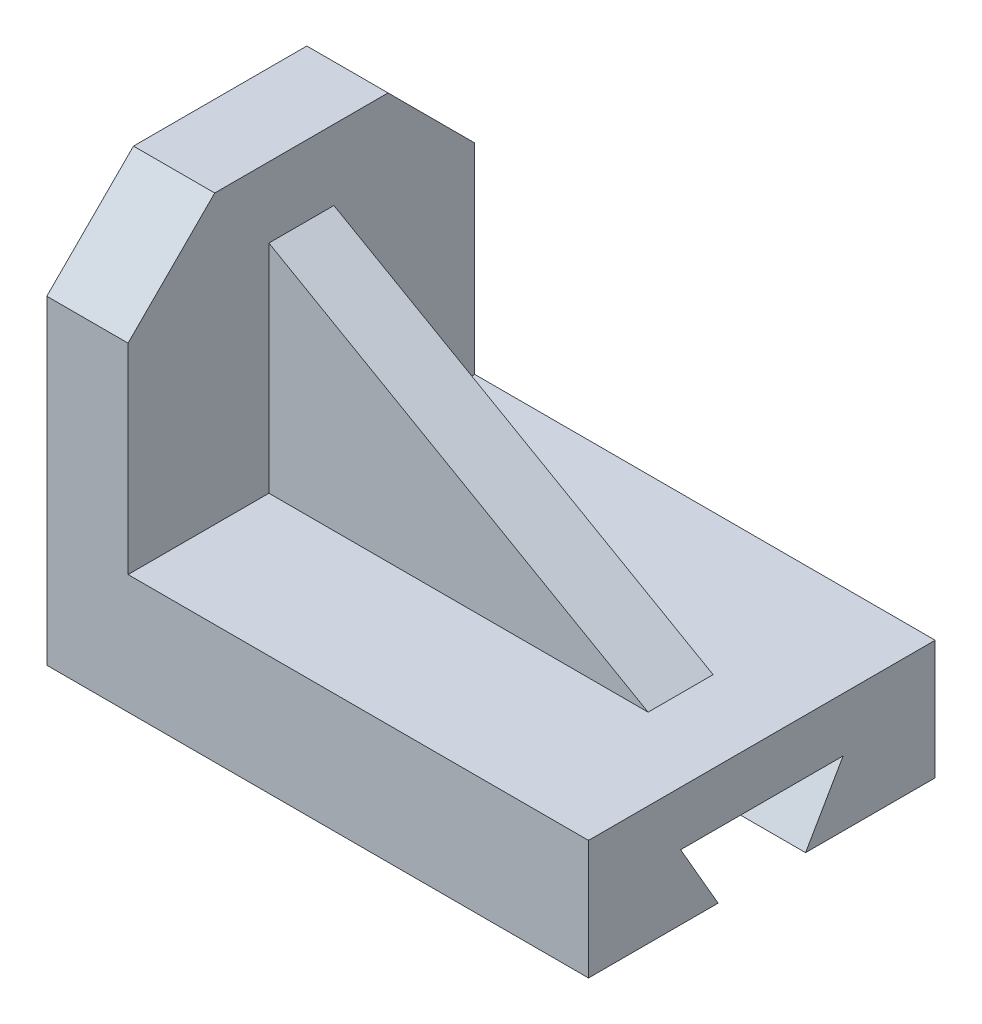
ISO-10303-21;
HEADER;
FILE_DESCRIPTION(('STEP AP214'),'2;1');
FILE_NAME('part.step','',(''),(''),'','','');
FILE_SCHEMA(('AUTOMOTIVE_DESIGN { 1 0 10303 214 1 1 1 1 }'));
ENDSEC;
DATA;
#1=APPLICATION_CONTEXT('core data for automotive mechanical design processes');
#2=APPLICATION_PROTOCOL_DEFINITION('international standard','automotive_design',2000,#1);
#3=PRODUCT_CONTEXT('',#1,'mechanical');
#4=PRODUCT('Part','Part','',(#3));
#5=PRODUCT_RELATED_PRODUCT_CATEGORY('part','',(#4));
#6=PRODUCT_DEFINITION_FORMATION('','',#4);
#7=PRODUCT_DEFINITION_CONTEXT('part definition',#1,'design');
#8=PRODUCT_DEFINITION('design','',#6,#7);
#9=PRODUCT_DEFINITION_SHAPE('','',#8);
#10=(LENGTH_UNIT() NAMED_UNIT(*) SI_UNIT(.MILLI.,.METRE.));
#11=(NAMED_UNIT(*) PLANE_ANGLE_UNIT() SI_UNIT($,.RADIAN.));
#12=(NAMED_UNIT(*) SI_UNIT($,.STERADIAN.) SOLID_ANGLE_UNIT());
#13=UNCERTAINTY_MEASURE_WITH_UNIT(LENGTH_MEASURE(1.E-05),#10,'distance_accuracy_value','');
#14=(GEOMETRIC_REPRESENTATION_CONTEXT(3) GLOBAL_UNCERTAINTY_ASSIGNED_CONTEXT((#13)) GLOBAL_UNIT_ASSIGNED_CONTEXT((#10,
#11,#12)) REPRESENTATION_CONTEXT('',''));
#15=CARTESIAN_POINT('',(0.,0.,0.));
#16=DIRECTION('',(0.,0.,1.));
#17=DIRECTION('',(1.,0.,0.));
#18=AXIS2_PLACEMENT_3D('',#15,#16,#17);
#19=CARTESIAN_POINT('',(0.,0.,0.));
#20=DIRECTION('',(0.,1.,0.));
#21=DIRECTION('',(0.,0.,1.));
#22=AXIS2_PLACEMENT_3D('',#19,#20,#21);
#23=PLANE('',#22);
#24=DIRECTION('',(0.,0.,1.));
#25=VECTOR('',#24,1.);
#26=CARTESIAN_POINT('',(-50.,0.,-32.));
#27=LINE('',#26,#25);
#28=CARTESIAN_POINT('',(-50.,0.,8.07179676972441));
#29=VERTEX_POINT('',#28);
#30=CARTESIAN_POINT('',(-50.,0.,32.));
#31=VERTEX_POINT('',#30);
#32=EDGE_CURVE('E242',#29,#31,#27,.T.);
#33=ORIENTED_EDGE('',*,*,#32,.F.);
#34=DIRECTION('',(1.,0.,0.));
#35=VECTOR('',#34,1.);
#36=CARTESIAN_POINT('',(-50.,0.,8.07179676972441));
#37=LINE('',#36,#35);
#38=CARTESIAN_POINT('',(50.,0.,8.07179676972441));
#39=VERTEX_POINT('',#38);
#40=EDGE_CURVE('E185',#29,#39,#37,.T.);
#41=ORIENTED_EDGE('',*,*,#40,.T.);
#42=DIRECTION('',(0.,0.,-1.));
#43=VECTOR('',#42,1.);
#44=CARTESIAN_POINT('',(50.,0.,32.));
#45=LINE('',#44,#43);
#46=CARTESIAN_POINT('',(50.,0.,32.));
#47=VERTEX_POINT('',#46);
#48=EDGE_CURVE('E235',#47,#39,#45,.T.);
#49=ORIENTED_EDGE('',*,*,#48,.F.);
#50=DIRECTION('',(1.,0.,0.));
#51=VECTOR('',#50,1.);
#52=CARTESIAN_POINT('',(-50.,0.,32.));
#53=LINE('',#52,#51);
#54=EDGE_CURVE('E246',#31,#47,#53,.T.);
#55=ORIENTED_EDGE('',*,*,#54,.F.);
#56=EDGE_LOOP('',(#33,#41,#49,#55));
#57=FACE_BOUND('',#56,.T.);
#58=ADVANCED_FACE('F37',(#57),#23,.F.);
#59=CARTESIAN_POINT('',(0.,22.,0.));
#60=DIRECTION('',(0.,1.,0.));
#61=DIRECTION('',(0.,0.,1.));
#62=AXIS2_PLACEMENT_3D('',#59,#60,#61);
#63=PLANE('',#62);
#64=DIRECTION('',(1.,0.,0.));
#65=VECTOR('',#64,1.);
#66=CARTESIAN_POINT('',(0.,22.,6.));
#67=LINE('',#66,#65);
#68=CARTESIAN_POINT('',(-35.,22.,6.));
#69=VERTEX_POINT('',#68);
#70=CARTESIAN_POINT('',(35.,22.,6.));
#71=VERTEX_POINT('',#70);
#72=EDGE_CURVE('E165',#69,#71,#67,.T.);
#73=ORIENTED_EDGE('',*,*,#72,.F.);
#74=DIRECTION('',(0.,0.,1.));
#75=VECTOR('',#74,1.);
#76=CARTESIAN_POINT('',(-35.,22.,32.));
#77=LINE('',#76,#75);
#78=CARTESIAN_POINT('',(-35.,22.,32.));
#79=VERTEX_POINT('',#78);
#80=EDGE_CURVE('E162',#69,#79,#77,.T.);
#81=ORIENTED_EDGE('',*,*,#80,.T.);
#82=DIRECTION('',(1.,0.,0.));
#83=VECTOR('',#82,1.);
#84=CARTESIAN_POINT('',(-50.,22.,32.));
#85=LINE('',#84,#83);
#86=CARTESIAN_POINT('',(50.,22.,32.));
#87=VERTEX_POINT('',#86);
#88=EDGE_CURVE('E234',#79,#87,#85,.T.);
#89=ORIENTED_EDGE('',*,*,#88,.T.);
#90=DIRECTION('',(0.,0.,-1.));
#91=VECTOR('',#90,1.);
#92=CARTESIAN_POINT('',(50.,22.,32.));
#93=LINE('',#92,#91);
#94=CARTESIAN_POINT('',(50.,22.,-32.));
#95=VERTEX_POINT('',#94);
#96=EDGE_CURVE('E237',#87,#95,#93,.T.);
#97=ORIENTED_EDGE('',*,*,#96,.T.);
#98=DIRECTION('',(-1.,0.,0.));
#99=VECTOR('',#98,1.);
#100=CARTESIAN_POINT('',(50.,22.,-32.));
#101=LINE('',#100,#99);
#102=CARTESIAN_POINT('',(-35.,22.,-32.));
#103=VERTEX_POINT('',#102);
#104=EDGE_CURVE('E231',#95,#103,#101,.T.);
#105=ORIENTED_EDGE('',*,*,#104,.T.);
#106=CARTESIAN_POINT('',(-35.,22.,-6.));
#107=VERTEX_POINT('',#106);
#108=EDGE_CURVE('E195',#103,#107,#77,.T.);
#109=ORIENTED_EDGE('',*,*,#108,.T.);
#110=DIRECTION('',(1.,0.,0.));
#111=VECTOR('',#110,1.);
#112=CARTESIAN_POINT('',(0.,22.,-6.));
#113=LINE('',#112,#111);
#114=CARTESIAN_POINT('',(35.,22.,-6.));
#115=VERTEX_POINT('',#114);
#116=EDGE_CURVE('E52',#107,#115,#113,.T.);
#117=ORIENTED_EDGE('',*,*,#116,.T.);
#118=DIRECTION('',(0.,0.,1.));
#119=VECTOR('',#118,1.);
#120=CARTESIAN_POINT('',(35.,22.,0.));
#121=LINE('',#120,#119);
#122=EDGE_CURVE('E155',#71,#115,#121,.F.);
#123=ORIENTED_EDGE('',*,*,#122,.F.);
#124=EDGE_LOOP('',(#73,#81,#89,#97,#105,#109,#117,#123));
#125=FACE_BOUND('',#124,.T.);
#126=ADVANCED_FACE('F292',(#125),#63,.T.);
#127=CARTESIAN_POINT('',(50.,22.,-32.));
#128=DIRECTION('',(0.,0.,1.));
#129=DIRECTION('',(1.,0.,0.));
#130=AXIS2_PLACEMENT_3D('',#127,#128,#129);
#131=PLANE('',#130);
#132=DIRECTION('',(-1.,0.,0.));
#133=VECTOR('',#132,1.);
#134=CARTESIAN_POINT('',(50.,0.,-32.));
#135=LINE('',#134,#133);
#136=CARTESIAN_POINT('',(50.,0.,-32.));
#137=VERTEX_POINT('',#136);
#138=CARTESIAN_POINT('',(-50.,0.,-32.));
#139=VERTEX_POINT('',#138);
#140=EDGE_CURVE('E224',#137,#139,#135,.T.);
#141=ORIENTED_EDGE('',*,*,#140,.T.);
#142=DIRECTION('',(0.,-1.,0.));
#143=VECTOR('',#142,1.);
#144=CARTESIAN_POINT('',(-50.,22.,-32.));
#145=LINE('',#144,#143);
#146=CARTESIAN_POINT('',(-50.,59.,-32.));
#147=VERTEX_POINT('',#146);
#148=EDGE_CURVE('E45',#147,#139,#145,.T.);
#149=ORIENTED_EDGE('',*,*,#148,.F.);
#150=DIRECTION('',(-1.,0.,0.));
#151=VECTOR('',#150,1.);
#152=CARTESIAN_POINT('',(-35.,59.,-32.));
#153=LINE('',#152,#151);
#154=CARTESIAN_POINT('',(-35.,59.,-32.));
#155=VERTEX_POINT('',#154);
#156=EDGE_CURVE('E221',#155,#147,#153,.T.);
#157=ORIENTED_EDGE('',*,*,#156,.F.);
#158=DIRECTION('',(0.,-1.,0.));
#159=VECTOR('',#158,1.);
#160=CARTESIAN_POINT('',(-35.,22.,-32.));
#161=LINE('',#160,#159);
#162=EDGE_CURVE('E209',#155,#103,#161,.T.);
#163=ORIENTED_EDGE('',*,*,#162,.T.);
#164=ORIENTED_EDGE('',*,*,#104,.F.);
#165=DIRECTION('',(0.,-1.,0.));
#166=VECTOR('',#165,1.);
#167=CARTESIAN_POINT('',(50.,22.,-32.));
#168=LINE('',#167,#166);
#169=EDGE_CURVE('E239',#95,#137,#168,.T.);
#170=ORIENTED_EDGE('',*,*,#169,.T.);
#171=EDGE_LOOP('',(#141,#149,#157,#163,#164,#170));
#172=FACE_BOUND('',#171,.T.);
#173=ADVANCED_FACE('F39',(#172),#131,.F.);
#174=CARTESIAN_POINT('',(-50.,22.,-32.));
#175=DIRECTION('',(1.,0.,0.));
#176=DIRECTION('',(0.,0.,-1.));
#177=AXIS2_PLACEMENT_3D('',#174,#175,#176);
#178=PLANE('',#177);
#179=DIRECTION('',(0.,0.,1.));
#180=VECTOR('',#179,1.);
#181=CARTESIAN_POINT('',(-50.,12.,15.));
#182=LINE('',#181,#180);
#183=CARTESIAN_POINT('',(-50.,12.,-15.));
#184=VERTEX_POINT('',#183);
#185=CARTESIAN_POINT('',(-50.,12.,15.));
#186=VERTEX_POINT('',#185);
#187=EDGE_CURVE('E173',#184,#186,#182,.T.);
#188=ORIENTED_EDGE('',*,*,#187,.T.);
#189=DIRECTION('',(0.,-0.866025403784436,-0.500000000000004));
#190=VECTOR('',#189,1.);
#191=CARTESIAN_POINT('',(-50.,0.,8.07179676972441));
#192=LINE('',#191,#190);
#193=EDGE_CURVE('E176',#186,#29,#192,.T.);
#194=ORIENTED_EDGE('',*,*,#193,.T.);
#195=ORIENTED_EDGE('',*,*,#32,.T.);
#196=DIRECTION('',(0.,-1.,0.));
#197=VECTOR('',#196,1.);
#198=CARTESIAN_POINT('',(-50.,22.,32.));
#199=LINE('',#198,#197);
#200=CARTESIAN_POINT('',(-50.,59.,32.));
#201=VERTEX_POINT('',#200);
#202=EDGE_CURVE('E256',#201,#31,#199,.T.);
#203=ORIENTED_EDGE('',*,*,#202,.F.);
#204=DIRECTION('',(0.,0.707106781186548,-0.707106781186547));
#205=VECTOR('',#204,1.);
#206=CARTESIAN_POINT('',(-50.,75.,16.));
#207=LINE('',#206,#205);
#208=CARTESIAN_POINT('',(-50.,75.,16.));
#209=VERTEX_POINT('',#208);
#210=EDGE_CURVE('E188',#201,#209,#207,.T.);
#211=ORIENTED_EDGE('',*,*,#210,.T.);
#212=DIRECTION('',(0.,0.,-1.));
#213=VECTOR('',#212,1.);
#214=CARTESIAN_POINT('',(-50.,75.,-16.));
#215=LINE('',#214,#213);
#216=CARTESIAN_POINT('',(-50.,75.,-16.));
#217=VERTEX_POINT('',#216);
#218=EDGE_CURVE('E215',#209,#217,#215,.T.);
#219=ORIENTED_EDGE('',*,*,#218,.T.);
#220=DIRECTION('',(0.,-0.707106781186548,-0.707106781186548));
#221=VECTOR('',#220,1.);
#222=CARTESIAN_POINT('',(-50.,59.,-32.));
#223=LINE('',#222,#221);
#224=EDGE_CURVE('E218',#217,#147,#223,.T.);
#225=ORIENTED_EDGE('',*,*,#224,.T.);
#226=ORIENTED_EDGE('',*,*,#148,.T.);
#227=CARTESIAN_POINT('',(-50.,0.,-8.07179676972441));
#228=VERTEX_POINT('',#227);
#229=EDGE_CURVE('E243',#139,#228,#27,.T.);
#230=ORIENTED_EDGE('',*,*,#229,.T.);
#231=DIRECTION('',(0.,0.866025403784436,-0.500000000000004));
#232=VECTOR('',#231,1.);
#233=CARTESIAN_POINT('',(-50.,12.,-15.));
#234=LINE('',#233,#232);
#235=EDGE_CURVE('E60',#228,#184,#234,.T.);
#236=ORIENTED_EDGE('',*,*,#235,.T.);
#237=EDGE_LOOP('',(#188,#194,#195,#203,#211,#219,#225,#226,#230,#236));
#238=FACE_BOUND('',#237,.T.);
#239=ADVANCED_FACE('F260',(#238),#178,.F.);
#240=CARTESIAN_POINT('',(-50.,22.,32.));
#241=DIRECTION('',(0.,0.,-1.));
#242=DIRECTION('',(-1.,0.,0.));
#243=AXIS2_PLACEMENT_3D('',#240,#241,#242);
#244=PLANE('',#243);
#245=ORIENTED_EDGE('',*,*,#54,.T.);
#246=DIRECTION('',(0.,-1.,0.));
#247=VECTOR('',#246,1.);
#248=CARTESIAN_POINT('',(50.,22.,32.));
#249=LINE('',#248,#247);
#250=EDGE_CURVE('E253',#87,#47,#249,.T.);
#251=ORIENTED_EDGE('',*,*,#250,.F.);
#252=ORIENTED_EDGE('',*,*,#88,.F.);
#253=DIRECTION('',(0.,1.,0.));
#254=VECTOR('',#253,1.);
#255=CARTESIAN_POINT('',(-35.,59.,32.));
#256=LINE('',#255,#254);
#257=CARTESIAN_POINT('',(-35.,59.,32.));
#258=VERTEX_POINT('',#257);
#259=EDGE_CURVE('E197',#79,#258,#256,.T.);
#260=ORIENTED_EDGE('',*,*,#259,.T.);
#261=DIRECTION('',(-1.,0.,0.));
#262=VECTOR('',#261,1.);
#263=CARTESIAN_POINT('',(-35.,59.,32.));
#264=LINE('',#263,#262);
#265=EDGE_CURVE('E212',#258,#201,#264,.T.);
#266=ORIENTED_EDGE('',*,*,#265,.T.);
#267=ORIENTED_EDGE('',*,*,#202,.T.);
#268=EDGE_LOOP('',(#245,#251,#252,#260,#266,#267));
#269=FACE_BOUND('',#268,.T.);
#270=ADVANCED_FACE('F288',(#269),#244,.F.);
#271=CARTESIAN_POINT('',(50.,22.,32.));
#272=DIRECTION('',(-1.,0.,0.));
#273=DIRECTION('',(0.,0.,1.));
#274=AXIS2_PLACEMENT_3D('',#271,#272,#273);
#275=PLANE('',#274);
#276=DIRECTION('',(0.,-0.866025403784436,-0.500000000000004));
#277=VECTOR('',#276,1.);
#278=CARTESIAN_POINT('',(50.,0.,8.07179676972441));
#279=LINE('',#278,#277);
#280=CARTESIAN_POINT('',(50.,12.,15.));
#281=VERTEX_POINT('',#280);
#282=EDGE_CURVE('E174',#281,#39,#279,.T.);
#283=ORIENTED_EDGE('',*,*,#282,.F.);
#284=DIRECTION('',(0.,0.,1.));
#285=VECTOR('',#284,1.);
#286=CARTESIAN_POINT('',(50.,12.,15.));
#287=LINE('',#286,#285);
#288=CARTESIAN_POINT('',(50.,12.,-15.));
#289=VERTEX_POINT('',#288);
#290=EDGE_CURVE('E182',#289,#281,#287,.T.);
#291=ORIENTED_EDGE('',*,*,#290,.F.);
#292=DIRECTION('',(0.,0.866025403784436,-0.500000000000004));
#293=VECTOR('',#292,1.);
#294=CARTESIAN_POINT('',(50.,12.,-15.));
#295=LINE('',#294,#293);
#296=CARTESIAN_POINT('',(50.,0.,-8.07179676972441));
#297=VERTEX_POINT('',#296);
#298=EDGE_CURVE('E171',#297,#289,#295,.T.);
#299=ORIENTED_EDGE('',*,*,#298,.F.);
#300=EDGE_CURVE('E248',#297,#137,#45,.T.);
#301=ORIENTED_EDGE('',*,*,#300,.T.);
#302=ORIENTED_EDGE('',*,*,#169,.F.);
#303=ORIENTED_EDGE('',*,*,#96,.F.);
#304=ORIENTED_EDGE('',*,*,#250,.T.);
#305=ORIENTED_EDGE('',*,*,#48,.T.);
#306=EDGE_LOOP('',(#283,#291,#299,#301,#302,#303,#304,#305));
#307=FACE_BOUND('',#306,.T.);
#308=ADVANCED_FACE('F274',(#307),#275,.F.);
#309=ORIENTED_EDGE('',*,*,#300,.F.);
#310=DIRECTION('',(1.,0.,0.));
#311=VECTOR('',#310,1.);
#312=CARTESIAN_POINT('',(-50.,0.,-8.07179676972441));
#313=LINE('',#312,#311);
#314=EDGE_CURVE('E179',#228,#297,#313,.T.);
#315=ORIENTED_EDGE('',*,*,#314,.F.);
#316=ORIENTED_EDGE('',*,*,#229,.F.);
#317=ORIENTED_EDGE('',*,*,#140,.F.);
#318=EDGE_LOOP('',(#309,#315,#316,#317));
#319=FACE_BOUND('',#318,.T.);
#320=ADVANCED_FACE('F268',(#319),#23,.F.);
#321=CARTESIAN_POINT('',(-35.,59.,-32.));
#322=DIRECTION('',(0.,0.707106781186547,-0.707106781186547));
#323=DIRECTION('',(0.,0.707106781186548,0.707106781186548));
#324=AXIS2_PLACEMENT_3D('',#321,#322,#323);
#325=PLANE('',#324);
#326=ORIENTED_EDGE('',*,*,#224,.F.);
#327=DIRECTION('',(-1.,0.,0.));
#328=VECTOR('',#327,1.);
#329=CARTESIAN_POINT('',(-35.,75.,-16.));
#330=LINE('',#329,#328);
#331=CARTESIAN_POINT('',(-35.,75.,-16.));
#332=VERTEX_POINT('',#331);
#333=EDGE_CURVE('E225',#332,#217,#330,.T.);
#334=ORIENTED_EDGE('',*,*,#333,.F.);
#335=DIRECTION('',(0.,-0.707106781186548,-0.707106781186548));
#336=VECTOR('',#335,1.);
#337=CARTESIAN_POINT('',(-35.,59.,-32.));
#338=LINE('',#337,#336);
#339=EDGE_CURVE('E206',#332,#155,#338,.T.);
#340=ORIENTED_EDGE('',*,*,#339,.T.);
#341=ORIENTED_EDGE('',*,*,#156,.T.);
#342=EDGE_LOOP('',(#326,#334,#340,#341));
#343=FACE_BOUND('',#342,.T.);
#344=ADVANCED_FACE('F303',(#343),#325,.T.);
#345=CARTESIAN_POINT('',(-35.,75.,-16.));
#346=DIRECTION('',(0.,1.,0.));
#347=DIRECTION('',(0.,0.,1.));
#348=AXIS2_PLACEMENT_3D('',#345,#346,#347);
#349=PLANE('',#348);
#350=ORIENTED_EDGE('',*,*,#218,.F.);
#351=DIRECTION('',(-1.,0.,0.));
#352=VECTOR('',#351,1.);
#353=CARTESIAN_POINT('',(-35.,75.,16.));
#354=LINE('',#353,#352);
#355=CARTESIAN_POINT('',(-35.,75.,16.));
#356=VERTEX_POINT('',#355);
#357=EDGE_CURVE('E227',#356,#209,#354,.T.);
#358=ORIENTED_EDGE('',*,*,#357,.F.);
#359=DIRECTION('',(0.,0.,-1.));
#360=VECTOR('',#359,1.);
#361=CARTESIAN_POINT('',(-35.,75.,-16.));
#362=LINE('',#361,#360);
#363=EDGE_CURVE('E203',#356,#332,#362,.T.);
#364=ORIENTED_EDGE('',*,*,#363,.T.);
#365=ORIENTED_EDGE('',*,*,#333,.T.);
#366=EDGE_LOOP('',(#350,#358,#364,#365));
#367=FACE_BOUND('',#366,.T.);
#368=ADVANCED_FACE('F301',(#367),#349,.T.);
#369=CARTESIAN_POINT('',(-35.,75.,16.));
#370=DIRECTION('',(0.,0.707106781186547,0.707106781186548));
#371=DIRECTION('',(0.,-0.707106781186548,0.707106781186547));
#372=AXIS2_PLACEMENT_3D('',#369,#370,#371);
#373=PLANE('',#372);
#374=ORIENTED_EDGE('',*,*,#210,.F.);
#375=ORIENTED_EDGE('',*,*,#265,.F.);
#376=DIRECTION('',(0.,0.707106781186548,-0.707106781186547));
#377=VECTOR('',#376,1.);
#378=CARTESIAN_POINT('',(-35.,75.,16.));
#379=LINE('',#378,#377);
#380=EDGE_CURVE('E200',#258,#356,#379,.T.);
#381=ORIENTED_EDGE('',*,*,#380,.T.);
#382=ORIENTED_EDGE('',*,*,#357,.T.);
#383=EDGE_LOOP('',(#374,#375,#381,#382));
#384=FACE_BOUND('',#383,.T.);
#385=ADVANCED_FACE('F298',(#384),#373,.T.);
#386=CARTESIAN_POINT('',(-35.,0.,0.));
#387=DIRECTION('',(1.,0.,0.));
#388=DIRECTION('',(0.,0.,-1.));
#389=AXIS2_PLACEMENT_3D('',#386,#387,#388);
#390=PLANE('',#389);
#391=DIRECTION('',(0.,-1.,0.));
#392=VECTOR('',#391,1.);
#393=CARTESIAN_POINT('',(-35.,0.,6.));
#394=LINE('',#393,#392);
#395=CARTESIAN_POINT('',(-35.,62.,6.));
#396=VERTEX_POINT('',#395);
#397=EDGE_CURVE('E160',#396,#69,#394,.T.);
#398=ORIENTED_EDGE('',*,*,#397,.F.);
#399=DIRECTION('',(0.,0.,-1.));
#400=VECTOR('',#399,1.);
#401=CARTESIAN_POINT('',(-35.,62.,0.));
#402=LINE('',#401,#400);
#403=CARTESIAN_POINT('',(-35.,62.,-6.));
#404=VERTEX_POINT('',#403);
#405=EDGE_CURVE('E11',#404,#396,#402,.F.);
#406=ORIENTED_EDGE('',*,*,#405,.F.);
#407=DIRECTION('',(0.,-1.,0.));
#408=VECTOR('',#407,1.);
#409=CARTESIAN_POINT('',(-35.,0.,-6.));
#410=LINE('',#409,#408);
#411=EDGE_CURVE('E141',#404,#107,#410,.T.);
#412=ORIENTED_EDGE('',*,*,#411,.T.);
#413=ORIENTED_EDGE('',*,*,#108,.F.);
#414=ORIENTED_EDGE('',*,*,#162,.F.);
#415=ORIENTED_EDGE('',*,*,#339,.F.);
#416=ORIENTED_EDGE('',*,*,#363,.F.);
#417=ORIENTED_EDGE('',*,*,#380,.F.);
#418=ORIENTED_EDGE('',*,*,#259,.F.);
#419=ORIENTED_EDGE('',*,*,#80,.F.);
#420=EDGE_LOOP('',(#398,#406,#412,#413,#414,#415,#416,#417,#418,#419));
#421=FACE_BOUND('',#420,.T.);
#422=ADVANCED_FACE('F158',(#421),#390,.T.);
#423=CARTESIAN_POINT('',(-50.,0.,8.07179676972441));
#424=DIRECTION('',(0.,-0.500000000000004,0.866025403784436));
#425=DIRECTION('',(0.,-0.866025403784436,-0.500000000000004));
#426=AXIS2_PLACEMENT_3D('',#423,#424,#425);
#427=PLANE('',#426);
#428=ORIENTED_EDGE('',*,*,#282,.T.);
#429=ORIENTED_EDGE('',*,*,#40,.F.);
#430=ORIENTED_EDGE('',*,*,#193,.F.);
#431=DIRECTION('',(1.,0.,0.));
#432=VECTOR('',#431,1.);
#433=CARTESIAN_POINT('',(-50.,12.,15.));
#434=LINE('',#433,#432);
#435=EDGE_CURVE('E189',#186,#281,#434,.T.);
#436=ORIENTED_EDGE('',*,*,#435,.T.);
#437=EDGE_LOOP('',(#428,#429,#430,#436));
#438=FACE_BOUND('',#437,.T.);
#439=ADVANCED_FACE('F281',(#438),#427,.F.);
#440=CARTESIAN_POINT('',(-50.,12.,15.));
#441=DIRECTION('',(0.,1.,0.));
#442=DIRECTION('',(0.,0.,1.));
#443=AXIS2_PLACEMENT_3D('',#440,#441,#442);
#444=PLANE('',#443);
#445=ORIENTED_EDGE('',*,*,#435,.F.);
#446=ORIENTED_EDGE('',*,*,#187,.F.);
#447=DIRECTION('',(1.,0.,0.));
#448=VECTOR('',#447,1.);
#449=CARTESIAN_POINT('',(-50.,12.,-15.));
#450=LINE('',#449,#448);
#451=EDGE_CURVE('E192',#184,#289,#450,.T.);
#452=ORIENTED_EDGE('',*,*,#451,.T.);
#453=ORIENTED_EDGE('',*,*,#290,.T.);
#454=EDGE_LOOP('',(#445,#446,#452,#453));
#455=FACE_BOUND('',#454,.T.);
#456=ADVANCED_FACE('F277',(#455),#444,.F.);
#457=CARTESIAN_POINT('',(-50.,12.,-15.));
#458=DIRECTION('',(0.,-0.500000000000004,-0.866025403784436));
#459=DIRECTION('',(0.,0.866025403784436,-0.500000000000004));
#460=AXIS2_PLACEMENT_3D('',#457,#458,#459);
#461=PLANE('',#460);
#462=ORIENTED_EDGE('',*,*,#298,.T.);
#463=ORIENTED_EDGE('',*,*,#451,.F.);
#464=ORIENTED_EDGE('',*,*,#235,.F.);
#465=ORIENTED_EDGE('',*,*,#314,.T.);
#466=EDGE_LOOP('',(#462,#463,#464,#465));
#467=FACE_BOUND('',#466,.T.);
#468=ADVANCED_FACE('F270',(#467),#461,.F.);
#469=CARTESIAN_POINT('',(-35.,62.,0.));
#470=DIRECTION('',(-0.496138938356834,-0.868243142124459,0.));
#471=DIRECTION('',(0.868243142124459,-0.496138938356834,0.));
#472=AXIS2_PLACEMENT_3D('',#469,#470,#471);
#473=PLANE('',#472);
#474=DIRECTION('',(0.868243142124459,-0.496138938356834,0.));
#475=VECTOR('',#474,1.);
#476=CARTESIAN_POINT('',(-35.,62.,6.));
#477=LINE('',#476,#475);
#478=EDGE_CURVE('E148',#396,#71,#477,.T.);
#479=ORIENTED_EDGE('',*,*,#478,.T.);
#480=ORIENTED_EDGE('',*,*,#122,.T.);
#481=DIRECTION('',(0.868243142124459,-0.496138938356834,0.));
#482=VECTOR('',#481,1.);
#483=CARTESIAN_POINT('',(-35.,62.,-6.));
#484=LINE('',#483,#482);
#485=EDGE_CURVE('E144',#404,#115,#484,.T.);
#486=ORIENTED_EDGE('',*,*,#485,.F.);
#487=ORIENTED_EDGE('',*,*,#405,.T.);
#488=EDGE_LOOP('',(#479,#480,#486,#487));
#489=FACE_BOUND('',#488,.T.);
#490=ADVANCED_FACE('F152',(#489),#473,.F.);
#491=CARTESIAN_POINT('',(0.,37.5,6.));
#492=DIRECTION('',(0.,0.,1.));
#493=DIRECTION('',(1.,0.,0.));
#494=AXIS2_PLACEMENT_3D('',#491,#492,#493);
#495=PLANE('',#494);
#496=ORIENTED_EDGE('',*,*,#397,.T.);
#497=ORIENTED_EDGE('',*,*,#72,.T.);
#498=ORIENTED_EDGE('',*,*,#478,.F.);
#499=EDGE_LOOP('',(#496,#497,#498));
#500=FACE_BOUND('',#499,.T.);
#501=ADVANCED_FACE('F305',(#500),#495,.T.);
#502=CARTESIAN_POINT('',(0.,37.5,-6.));
#503=DIRECTION('',(0.,0.,1.));
#504=DIRECTION('',(1.,0.,0.));
#505=AXIS2_PLACEMENT_3D('',#502,#503,#504);
#506=PLANE('',#505);
#507=ORIENTED_EDGE('',*,*,#116,.F.);
#508=ORIENTED_EDGE('',*,*,#411,.F.);
#509=ORIENTED_EDGE('',*,*,#485,.T.);
#510=EDGE_LOOP('',(#507,#508,#509));
#511=FACE_BOUND('',#510,.T.);
#512=ADVANCED_FACE('F143',(#511),#506,.F.);
#513=CLOSED_SHELL('',(#58,#126,#173,#239,#270,#308,#320,#344,#368,#385,#422,#439,#456,#468,#490,
#501,#512));
#514=MANIFOLD_SOLID_BREP('B2',#513);
#515=ADVANCED_BREP_SHAPE_REPRESENTATION('',(#18,#514),#14);
#516=SHAPE_DEFINITION_REPRESENTATION(#9,#515);
ENDSEC;
END-ISO-10303-21;
